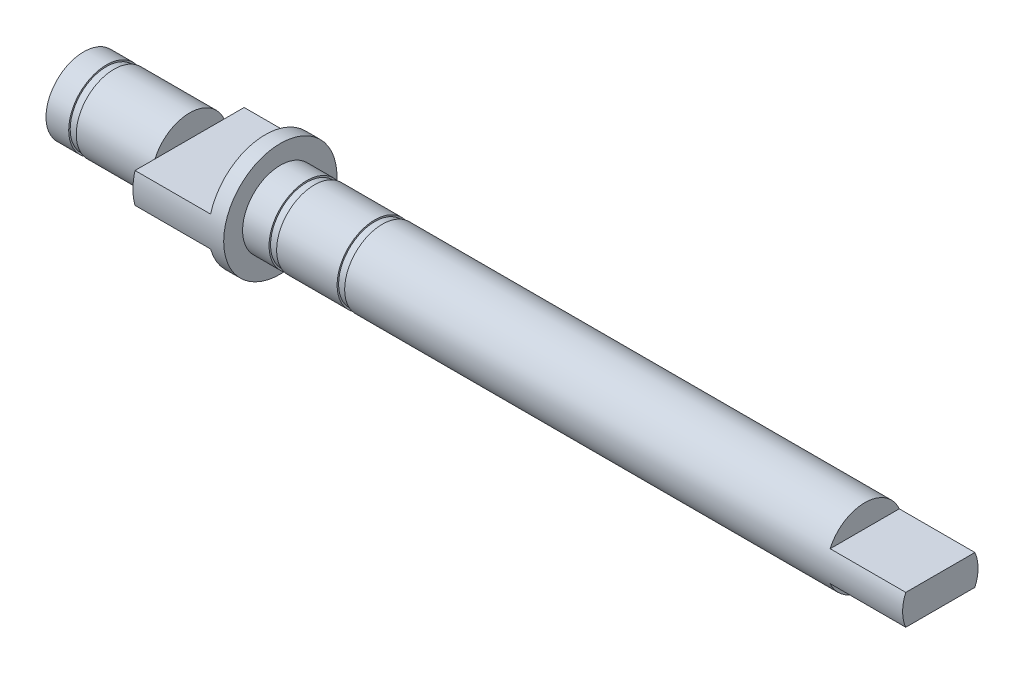
ISO-10303-21;
HEADER;
FILE_DESCRIPTION(('STEP AP214'),'2;1');
FILE_NAME('part.step','',(''),(''),'','','');
FILE_SCHEMA(('AUTOMOTIVE_DESIGN { 1 0 10303 214 1 1 1 1 }'));
ENDSEC;
DATA;
#1=APPLICATION_CONTEXT('core data for automotive mechanical design processes');
#2=APPLICATION_PROTOCOL_DEFINITION('international standard','automotive_design',2000,#1);
#3=PRODUCT_CONTEXT('',#1,'mechanical');
#4=PRODUCT('Part','Part','',(#3));
#5=PRODUCT_RELATED_PRODUCT_CATEGORY('part','',(#4));
#6=PRODUCT_DEFINITION_FORMATION('','',#4);
#7=PRODUCT_DEFINITION_CONTEXT('part definition',#1,'design');
#8=PRODUCT_DEFINITION('design','',#6,#7);
#9=PRODUCT_DEFINITION_SHAPE('','',#8);
#10=(LENGTH_UNIT() NAMED_UNIT(*) SI_UNIT(.MILLI.,.METRE.));
#11=(NAMED_UNIT(*) PLANE_ANGLE_UNIT() SI_UNIT($,.RADIAN.));
#12=(NAMED_UNIT(*) SI_UNIT($,.STERADIAN.) SOLID_ANGLE_UNIT());
#13=UNCERTAINTY_MEASURE_WITH_UNIT(LENGTH_MEASURE(1.E-05),#10,'distance_accuracy_value','');
#14=(GEOMETRIC_REPRESENTATION_CONTEXT(3) GLOBAL_UNCERTAINTY_ASSIGNED_CONTEXT((#13)) GLOBAL_UNIT_ASSIGNED_CONTEXT((#10,
#11,#12)) REPRESENTATION_CONTEXT('',''));
#15=CARTESIAN_POINT('',(0.,0.,0.));
#16=DIRECTION('',(0.,0.,1.));
#17=DIRECTION('',(1.,0.,0.));
#18=AXIS2_PLACEMENT_3D('',#15,#16,#17);
#19=CARTESIAN_POINT('',(14.,0.,-7.49));
#20=DIRECTION('',(1.,0.,0.));
#21=DIRECTION('',(0.,0.,-1.));
#22=AXIS2_PLACEMENT_3D('',#19,#20,#21);
#23=PLANE('',#22);
#24=CARTESIAN_POINT('',(14.,0.,0.));
#25=DIRECTION('',(-1.,0.,0.));
#26=DIRECTION('',(0.,0.,1.));
#27=AXIS2_PLACEMENT_3D('',#24,#25,#26);
#28=CIRCLE('',#27,7.49);
#29=CARTESIAN_POINT('',(14.,-2.,7.2180399001391));
#30=VERTEX_POINT('',#29);
#31=CARTESIAN_POINT('',(14.,2.,7.2180399001391));
#32=VERTEX_POINT('',#31);
#33=EDGE_CURVE('E236',#30,#32,#28,.T.);
#34=ORIENTED_EDGE('',*,*,#33,.T.);
#35=DIRECTION('',(0.,0.,1.));
#36=VECTOR('',#35,1.);
#37=CARTESIAN_POINT('',(14.,2.,7.22841614740048));
#38=LINE('',#37,#36);
#39=CARTESIAN_POINT('',(14.,2.,4.57166271721788));
#40=VERTEX_POINT('',#39);
#41=EDGE_CURVE('E289',#40,#32,#38,.T.);
#42=ORIENTED_EDGE('',*,*,#41,.F.);
#43=CARTESIAN_POINT('',(14.,0.,0.));
#44=DIRECTION('',(-1.,0.,0.));
#45=DIRECTION('',(0.,0.,1.));
#46=AXIS2_PLACEMENT_3D('',#43,#44,#45);
#47=CIRCLE('',#46,4.99);
#48=CARTESIAN_POINT('',(14.,-2.,4.57166271721789));
#49=VERTEX_POINT('',#48);
#50=EDGE_CURVE('E231',#49,#40,#47,.T.);
#51=ORIENTED_EDGE('',*,*,#50,.F.);
#52=DIRECTION('',(0.,0.,-1.));
#53=VECTOR('',#52,1.);
#54=CARTESIAN_POINT('',(14.,-2.,7.22841614740048));
#55=LINE('',#54,#53);
#56=EDGE_CURVE('E288',#30,#49,#55,.T.);
#57=ORIENTED_EDGE('',*,*,#56,.F.);
#58=EDGE_LOOP('',(#34,#42,#51,#57));
#59=FACE_BOUND('',#58,.T.);
#60=ADVANCED_FACE('F47',(#59),#23,.F.);
#61=CARTESIAN_POINT('',(0.,0.,-4.99));
#62=DIRECTION('',(1.,0.,0.));
#63=DIRECTION('',(0.,0.,-1.));
#64=AXIS2_PLACEMENT_3D('',#61,#62,#63);
#65=PLANE('',#64);
#66=CARTESIAN_POINT('',(0.,0.,0.));
#67=DIRECTION('',(-1.,0.,0.));
#68=DIRECTION('',(0.,0.,1.));
#69=AXIS2_PLACEMENT_3D('',#66,#67,#68);
#70=CIRCLE('',#69,4.99);
#71=CARTESIAN_POINT('',(0.,0.,4.99));
#72=VERTEX_POINT('',#71);
#73=EDGE_CURVE('E261',#72,#72,#70,.T.);
#74=ORIENTED_EDGE('',*,*,#73,.T.);
#75=EDGE_LOOP('',(#74));
#76=FACE_BOUND('',#75,.T.);
#77=ADVANCED_FACE('F49',(#76),#65,.F.);
#78=CARTESIAN_POINT('',(113.3,0.,0.));
#79=DIRECTION('',(-1.,0.,0.));
#80=DIRECTION('',(0.,0.,1.));
#81=AXIS2_PLACEMENT_3D('',#78,#79,#80);
#82=PLANE('',#81);
#83=CARTESIAN_POINT('',(113.3,0.,0.));
#84=DIRECTION('',(-1.,0.,0.));
#85=DIRECTION('',(0.,0.,1.));
#86=AXIS2_PLACEMENT_3D('',#83,#84,#85);
#87=CIRCLE('',#86,4.99000000000001);
#88=CARTESIAN_POINT('',(113.3,2.,-4.57166271721789));
#89=VERTEX_POINT('',#88);
#90=CARTESIAN_POINT('',(113.3,-2.,-4.57166271721789));
#91=VERTEX_POINT('',#90);
#92=EDGE_CURVE('E141',#89,#91,#87,.T.);
#93=ORIENTED_EDGE('',*,*,#92,.F.);
#94=DIRECTION('',(0.,0.,-1.));
#95=VECTOR('',#94,1.);
#96=CARTESIAN_POINT('',(113.3,2.,-4.58257569495584));
#97=LINE('',#96,#95);
#98=CARTESIAN_POINT('',(113.3,2.,4.57166271721789));
#99=VERTEX_POINT('',#98);
#100=EDGE_CURVE('E145',#99,#89,#97,.T.);
#101=ORIENTED_EDGE('',*,*,#100,.F.);
#102=CARTESIAN_POINT('',(113.3,-2.,4.57166271721789));
#103=VERTEX_POINT('',#102);
#104=EDGE_CURVE('E143',#103,#99,#87,.T.);
#105=ORIENTED_EDGE('',*,*,#104,.F.);
#106=DIRECTION('',(0.,0.,1.));
#107=VECTOR('',#106,1.);
#108=CARTESIAN_POINT('',(113.3,-2.,4.58257569495584));
#109=LINE('',#108,#107);
#110=EDGE_CURVE('E127',#91,#103,#109,.T.);
#111=ORIENTED_EDGE('',*,*,#110,.F.);
#112=EDGE_LOOP('',(#93,#101,#105,#111));
#113=FACE_BOUND('',#112,.T.);
#114=ADVANCED_FACE('F139',(#113),#82,.F.);
#115=CARTESIAN_POINT('',(0.,0.,0.));
#116=DIRECTION('',(-1.,0.,0.));
#117=DIRECTION('',(0.,0.,1.));
#118=AXIS2_PLACEMENT_3D('',#115,#116,#117);
#119=CYLINDRICAL_SURFACE('',#118,4.99000000000001);
#120=ORIENTED_EDGE('',*,*,#104,.T.);
#121=DIRECTION('',(-1.,0.,0.));
#122=VECTOR('',#121,1.);
#123=CARTESIAN_POINT('',(0.,2.,4.57166271721789));
#124=LINE('',#123,#122);
#125=CARTESIAN_POINT('',(103.3,2.,4.57166271721789));
#126=VERTEX_POINT('',#125);
#127=EDGE_CURVE('E11',#99,#126,#124,.T.);
#128=ORIENTED_EDGE('',*,*,#127,.T.);
#129=CARTESIAN_POINT('',(103.3,0.,0.));
#130=DIRECTION('',(1.,0.,0.));
#131=DIRECTION('',(0.,0.,-1.));
#132=AXIS2_PLACEMENT_3D('',#129,#130,#131);
#133=CIRCLE('',#132,4.99000000000001);
#134=CARTESIAN_POINT('',(103.3,2.,-4.57166271721789));
#135=VERTEX_POINT('',#134);
#136=EDGE_CURVE('E133',#135,#126,#133,.T.);
#137=ORIENTED_EDGE('',*,*,#136,.F.);
#138=DIRECTION('',(-1.,0.,0.));
#139=VECTOR('',#138,1.);
#140=CARTESIAN_POINT('',(0.,2.,-4.57166271721789));
#141=LINE('',#140,#139);
#142=EDGE_CURVE('E56',#135,#89,#141,.F.);
#143=ORIENTED_EDGE('',*,*,#142,.T.);
#144=ORIENTED_EDGE('',*,*,#92,.T.);
#145=DIRECTION('',(-1.,0.,0.));
#146=VECTOR('',#145,1.);
#147=CARTESIAN_POINT('',(0.,-2.,-4.57166271721789));
#148=LINE('',#147,#146);
#149=CARTESIAN_POINT('',(103.3,-2.,-4.57166271721789));
#150=VERTEX_POINT('',#149);
#151=EDGE_CURVE('E124',#91,#150,#148,.T.);
#152=ORIENTED_EDGE('',*,*,#151,.T.);
#153=CARTESIAN_POINT('',(103.3,0.,0.));
#154=DIRECTION('',(1.,0.,0.));
#155=DIRECTION('',(0.,0.,-1.));
#156=AXIS2_PLACEMENT_3D('',#153,#154,#155);
#157=CIRCLE('',#156,4.99000000000001);
#158=CARTESIAN_POINT('',(103.3,-2.,4.57166271721789));
#159=VERTEX_POINT('',#158);
#160=EDGE_CURVE('E165',#159,#150,#157,.T.);
#161=ORIENTED_EDGE('',*,*,#160,.F.);
#162=DIRECTION('',(-1.,0.,0.));
#163=VECTOR('',#162,1.);
#164=CARTESIAN_POINT('',(0.,-2.,4.57166271721789));
#165=LINE('',#164,#163);
#166=EDGE_CURVE('E134',#159,#103,#165,.F.);
#167=ORIENTED_EDGE('',*,*,#166,.T.);
#168=EDGE_LOOP('',(#120,#128,#137,#143,#144,#152,#161,#167));
#169=FACE_BOUND('',#168,.T.);
#170=CARTESIAN_POINT('',(39.5,0.,0.));
#171=DIRECTION('',(-1.,0.,0.));
#172=DIRECTION('',(0.,0.,1.));
#173=AXIS2_PLACEMENT_3D('',#170,#171,#172);
#174=CIRCLE('',#173,4.99);
#175=CARTESIAN_POINT('',(39.5,0.,4.99));
#176=VERTEX_POINT('',#175);
#177=EDGE_CURVE('E158',#176,#176,#174,.T.);
#178=ORIENTED_EDGE('',*,*,#177,.F.);
#179=EDGE_LOOP('',(#178));
#180=FACE_BOUND('',#179,.T.);
#181=ADVANCED_FACE('F148',(#169,#180),#119,.T.);
#182=CARTESIAN_POINT('',(39.5,0.,-4.99));
#183=DIRECTION('',(1.,0.,0.));
#184=DIRECTION('',(0.,0.,-1.));
#185=AXIS2_PLACEMENT_3D('',#182,#183,#184);
#186=PLANE('',#185);
#187=CARTESIAN_POINT('',(39.5,0.,0.));
#188=DIRECTION('',(-1.,0.,0.));
#189=DIRECTION('',(0.,0.,1.));
#190=AXIS2_PLACEMENT_3D('',#187,#188,#189);
#191=CIRCLE('',#190,4.79000000000001);
#192=CARTESIAN_POINT('',(39.5,0.,4.79000000000001));
#193=VERTEX_POINT('',#192);
#194=EDGE_CURVE('E584',#193,#193,#191,.T.);
#195=ORIENTED_EDGE('',*,*,#194,.F.);
#196=EDGE_LOOP('',(#195));
#197=FACE_BOUND('',#196,.T.);
#198=ORIENTED_EDGE('',*,*,#177,.T.);
#199=EDGE_LOOP('',(#198));
#200=FACE_BOUND('',#199,.T.);
#201=ADVANCED_FACE('F437',(#197,#200),#186,.F.);
#202=CARTESIAN_POINT('',(0.,0.,0.));
#203=DIRECTION('',(-1.,0.,0.));
#204=DIRECTION('',(0.,0.,1.));
#205=AXIS2_PLACEMENT_3D('',#202,#203,#204);
#206=CYLINDRICAL_SURFACE('',#205,4.79000000000001);
#207=CARTESIAN_POINT('',(38.5,0.,0.));
#208=DIRECTION('',(-1.,0.,0.));
#209=DIRECTION('',(0.,0.,1.));
#210=AXIS2_PLACEMENT_3D('',#207,#208,#209);
#211=CIRCLE('',#210,4.79000000000001);
#212=CARTESIAN_POINT('',(38.5,0.,4.79000000000001));
#213=VERTEX_POINT('',#212);
#214=EDGE_CURVE('E581',#213,#213,#211,.T.);
#215=ORIENTED_EDGE('',*,*,#214,.F.);
#216=EDGE_LOOP('',(#215));
#217=FACE_BOUND('',#216,.T.);
#218=ORIENTED_EDGE('',*,*,#194,.T.);
#219=EDGE_LOOP('',(#218));
#220=FACE_BOUND('',#219,.T.);
#221=ADVANCED_FACE('F458',(#217,#220),#206,.T.);
#222=CARTESIAN_POINT('',(38.5,0.,-4.79000000000001));
#223=DIRECTION('',(-1.,0.,0.));
#224=DIRECTION('',(0.,0.,1.));
#225=AXIS2_PLACEMENT_3D('',#222,#223,#224);
#226=PLANE('',#225);
#227=CARTESIAN_POINT('',(38.5,0.,0.));
#228=DIRECTION('',(-1.,0.,0.));
#229=DIRECTION('',(0.,0.,1.));
#230=AXIS2_PLACEMENT_3D('',#227,#228,#229);
#231=CIRCLE('',#230,4.99);
#232=CARTESIAN_POINT('',(38.5,0.,4.99));
#233=VERTEX_POINT('',#232);
#234=EDGE_CURVE('E577',#233,#233,#231,.T.);
#235=ORIENTED_EDGE('',*,*,#234,.F.);
#236=EDGE_LOOP('',(#235));
#237=FACE_BOUND('',#236,.T.);
#238=ORIENTED_EDGE('',*,*,#214,.T.);
#239=EDGE_LOOP('',(#238));
#240=FACE_BOUND('',#239,.T.);
#241=ADVANCED_FACE('F467',(#237,#240),#226,.F.);
#242=CARTESIAN_POINT('',(0.,0.,0.));
#243=DIRECTION('',(-1.,0.,0.));
#244=DIRECTION('',(0.,0.,1.));
#245=AXIS2_PLACEMENT_3D('',#242,#243,#244);
#246=CYLINDRICAL_SURFACE('',#245,4.99);
#247=CARTESIAN_POINT('',(30.5,0.,0.));
#248=DIRECTION('',(-1.,0.,0.));
#249=DIRECTION('',(0.,0.,1.));
#250=AXIS2_PLACEMENT_3D('',#247,#248,#249);
#251=CIRCLE('',#250,4.99);
#252=CARTESIAN_POINT('',(30.5,0.,4.99));
#253=VERTEX_POINT('',#252);
#254=EDGE_CURVE('E573',#253,#253,#251,.T.);
#255=ORIENTED_EDGE('',*,*,#254,.F.);
#256=EDGE_LOOP('',(#255));
#257=FACE_BOUND('',#256,.T.);
#258=ORIENTED_EDGE('',*,*,#234,.T.);
#259=EDGE_LOOP('',(#258));
#260=FACE_BOUND('',#259,.T.);
#261=ADVANCED_FACE('F476',(#257,#260),#246,.T.);
#262=CARTESIAN_POINT('',(30.5,0.,-4.99));
#263=DIRECTION('',(1.,0.,0.));
#264=DIRECTION('',(0.,0.,-1.));
#265=AXIS2_PLACEMENT_3D('',#262,#263,#264);
#266=PLANE('',#265);
#267=CARTESIAN_POINT('',(30.5,0.,0.));
#268=DIRECTION('',(-1.,0.,0.));
#269=DIRECTION('',(0.,0.,1.));
#270=AXIS2_PLACEMENT_3D('',#267,#268,#269);
#271=CIRCLE('',#270,4.79000000000001);
#272=CARTESIAN_POINT('',(30.5,0.,4.79000000000001));
#273=VERTEX_POINT('',#272);
#274=EDGE_CURVE('E569',#273,#273,#271,.T.);
#275=ORIENTED_EDGE('',*,*,#274,.F.);
#276=EDGE_LOOP('',(#275));
#277=FACE_BOUND('',#276,.T.);
#278=ORIENTED_EDGE('',*,*,#254,.T.);
#279=EDGE_LOOP('',(#278));
#280=FACE_BOUND('',#279,.T.);
#281=ADVANCED_FACE('F485',(#277,#280),#266,.F.);
#282=CARTESIAN_POINT('',(0.,0.,0.));
#283=DIRECTION('',(-1.,0.,0.));
#284=DIRECTION('',(0.,0.,1.));
#285=AXIS2_PLACEMENT_3D('',#282,#283,#284);
#286=CYLINDRICAL_SURFACE('',#285,4.79000000000001);
#287=CARTESIAN_POINT('',(29.5,0.,0.));
#288=DIRECTION('',(-1.,0.,0.));
#289=DIRECTION('',(0.,0.,1.));
#290=AXIS2_PLACEMENT_3D('',#287,#288,#289);
#291=CIRCLE('',#290,4.79000000000001);
#292=CARTESIAN_POINT('',(29.5,0.,4.79000000000001));
#293=VERTEX_POINT('',#292);
#294=EDGE_CURVE('E562',#293,#293,#291,.T.);
#295=ORIENTED_EDGE('',*,*,#294,.F.);
#296=EDGE_LOOP('',(#295));
#297=FACE_BOUND('',#296,.T.);
#298=ORIENTED_EDGE('',*,*,#274,.T.);
#299=EDGE_LOOP('',(#298));
#300=FACE_BOUND('',#299,.T.);
#301=ADVANCED_FACE('F494',(#297,#300),#286,.T.);
#302=CARTESIAN_POINT('',(29.5,0.,-4.79000000000001));
#303=DIRECTION('',(-1.,0.,0.));
#304=DIRECTION('',(0.,0.,1.));
#305=AXIS2_PLACEMENT_3D('',#302,#303,#304);
#306=PLANE('',#305);
#307=CARTESIAN_POINT('',(29.5,0.,0.));
#308=DIRECTION('',(-1.,0.,0.));
#309=DIRECTION('',(0.,0.,1.));
#310=AXIS2_PLACEMENT_3D('',#307,#308,#309);
#311=CIRCLE('',#310,4.99);
#312=CARTESIAN_POINT('',(29.5,0.,4.99));
#313=VERTEX_POINT('',#312);
#314=EDGE_CURVE('E557',#313,#313,#311,.T.);
#315=ORIENTED_EDGE('',*,*,#314,.F.);
#316=EDGE_LOOP('',(#315));
#317=FACE_BOUND('',#316,.T.);
#318=ORIENTED_EDGE('',*,*,#294,.T.);
#319=EDGE_LOOP('',(#318));
#320=FACE_BOUND('',#319,.T.);
#321=ADVANCED_FACE('F503',(#317,#320),#306,.F.);
#322=CARTESIAN_POINT('',(0.,0.,0.));
#323=DIRECTION('',(-1.,0.,0.));
#324=DIRECTION('',(0.,0.,1.));
#325=AXIS2_PLACEMENT_3D('',#322,#323,#324);
#326=CYLINDRICAL_SURFACE('',#325,4.99);
#327=CARTESIAN_POINT('',(26.,0.,0.));
#328=DIRECTION('',(-1.,0.,0.));
#329=DIRECTION('',(0.,0.,1.));
#330=AXIS2_PLACEMENT_3D('',#327,#328,#329);
#331=CIRCLE('',#330,4.99);
#332=CARTESIAN_POINT('',(26.,0.,4.99));
#333=VERTEX_POINT('',#332);
#334=EDGE_CURVE('E555',#333,#333,#331,.T.);
#335=ORIENTED_EDGE('',*,*,#334,.F.);
#336=EDGE_LOOP('',(#335));
#337=FACE_BOUND('',#336,.T.);
#338=ORIENTED_EDGE('',*,*,#314,.T.);
#339=EDGE_LOOP('',(#338));
#340=FACE_BOUND('',#339,.T.);
#341=ADVANCED_FACE('F511',(#337,#340),#326,.T.);
#342=CARTESIAN_POINT('',(26.,0.,-4.99));
#343=DIRECTION('',(-1.,0.,0.));
#344=DIRECTION('',(0.,0.,1.));
#345=AXIS2_PLACEMENT_3D('',#342,#343,#344);
#346=PLANE('',#345);
#347=CARTESIAN_POINT('',(26.,0.,0.));
#348=DIRECTION('',(-1.,0.,0.));
#349=DIRECTION('',(0.,0.,1.));
#350=AXIS2_PLACEMENT_3D('',#347,#348,#349);
#351=CIRCLE('',#350,7.49);
#352=CARTESIAN_POINT('',(26.,0.,7.49));
#353=VERTEX_POINT('',#352);
#354=EDGE_CURVE('E552',#353,#353,#351,.T.);
#355=ORIENTED_EDGE('',*,*,#354,.F.);
#356=EDGE_LOOP('',(#355));
#357=FACE_BOUND('',#356,.T.);
#358=ORIENTED_EDGE('',*,*,#334,.T.);
#359=EDGE_LOOP('',(#358));
#360=FACE_BOUND('',#359,.T.);
#361=ADVANCED_FACE('F211',(#357,#360),#346,.F.);
#362=CARTESIAN_POINT('',(0.,0.,0.));
#363=DIRECTION('',(-1.,0.,0.));
#364=DIRECTION('',(0.,0.,1.));
#365=AXIS2_PLACEMENT_3D('',#362,#363,#364);
#366=CYLINDRICAL_SURFACE('',#365,7.49);
#367=CARTESIAN_POINT('',(24.,0.,0.));
#368=DIRECTION('',(1.,0.,0.));
#369=DIRECTION('',(0.,0.,-1.));
#370=AXIS2_PLACEMENT_3D('',#367,#368,#369);
#371=CIRCLE('',#370,7.49);
#372=CARTESIAN_POINT('',(24.,2.,-7.2180399001391));
#373=VERTEX_POINT('',#372);
#374=CARTESIAN_POINT('',(24.,2.,7.2180399001391));
#375=VERTEX_POINT('',#374);
#376=EDGE_CURVE('E156',#373,#375,#371,.T.);
#377=ORIENTED_EDGE('',*,*,#376,.T.);
#378=DIRECTION('',(-1.,0.,0.));
#379=VECTOR('',#378,1.);
#380=CARTESIAN_POINT('',(0.,2.,7.2180399001391));
#381=LINE('',#380,#379);
#382=EDGE_CURVE('E265',#375,#32,#381,.T.);
#383=ORIENTED_EDGE('',*,*,#382,.T.);
#384=ORIENTED_EDGE('',*,*,#33,.F.);
#385=DIRECTION('',(-1.,0.,0.));
#386=VECTOR('',#385,1.);
#387=CARTESIAN_POINT('',(0.,-2.,7.2180399001391));
#388=LINE('',#387,#386);
#389=CARTESIAN_POINT('',(24.,-2.,7.2180399001391));
#390=VERTEX_POINT('',#389);
#391=EDGE_CURVE('E277',#30,#390,#388,.F.);
#392=ORIENTED_EDGE('',*,*,#391,.T.);
#393=CARTESIAN_POINT('',(24.,0.,0.));
#394=DIRECTION('',(-1.,0.,0.));
#395=DIRECTION('',(0.,0.,1.));
#396=AXIS2_PLACEMENT_3D('',#393,#394,#395);
#397=CIRCLE('',#396,7.49);
#398=CARTESIAN_POINT('',(24.,-2.,-7.2180399001391));
#399=VERTEX_POINT('',#398);
#400=EDGE_CURVE('E152',#399,#390,#397,.T.);
#401=ORIENTED_EDGE('',*,*,#400,.F.);
#402=DIRECTION('',(-1.,0.,0.));
#403=VECTOR('',#402,1.);
#404=CARTESIAN_POINT('',(0.,-2.,-7.2180399001391));
#405=LINE('',#404,#403);
#406=CARTESIAN_POINT('',(14.,-2.,-7.2180399001391));
#407=VERTEX_POINT('',#406);
#408=EDGE_CURVE('E273',#399,#407,#405,.T.);
#409=ORIENTED_EDGE('',*,*,#408,.T.);
#410=CARTESIAN_POINT('',(14.,2.,-7.2180399001391));
#411=VERTEX_POINT('',#410);
#412=EDGE_CURVE('E238',#411,#407,#28,.T.);
#413=ORIENTED_EDGE('',*,*,#412,.F.);
#414=DIRECTION('',(-1.,0.,0.));
#415=VECTOR('',#414,1.);
#416=CARTESIAN_POINT('',(0.,2.,-7.2180399001391));
#417=LINE('',#416,#415);
#418=EDGE_CURVE('E269',#411,#373,#417,.F.);
#419=ORIENTED_EDGE('',*,*,#418,.T.);
#420=EDGE_LOOP('',(#377,#383,#384,#392,#401,#409,#413,#419));
#421=FACE_BOUND('',#420,.T.);
#422=ORIENTED_EDGE('',*,*,#354,.T.);
#423=EDGE_LOOP('',(#422));
#424=FACE_BOUND('',#423,.T.);
#425=ADVANCED_FACE('F204',(#421,#424),#366,.T.);
#426=CARTESIAN_POINT('',(14.,2.,-4.57166271721788));
#427=VERTEX_POINT('',#426);
#428=CARTESIAN_POINT('',(14.,-2.,-4.57166271721789));
#429=VERTEX_POINT('',#428);
#430=EDGE_CURVE('E217',#427,#429,#47,.T.);
#431=ORIENTED_EDGE('',*,*,#430,.F.);
#432=EDGE_CURVE('E220',#411,#427,#38,.T.);
#433=ORIENTED_EDGE('',*,*,#432,.F.);
#434=ORIENTED_EDGE('',*,*,#412,.T.);
#435=EDGE_CURVE('E222',#429,#407,#55,.T.);
#436=ORIENTED_EDGE('',*,*,#435,.F.);
#437=EDGE_LOOP('',(#431,#433,#434,#436));
#438=FACE_BOUND('',#437,.T.);
#439=ADVANCED_FACE('F192',(#438),#23,.F.);
#440=CARTESIAN_POINT('',(0.,0.,0.));
#441=DIRECTION('',(-1.,0.,0.));
#442=DIRECTION('',(0.,0.,1.));
#443=AXIS2_PLACEMENT_3D('',#440,#441,#442);
#444=CYLINDRICAL_SURFACE('',#443,4.99);
#445=CARTESIAN_POINT('',(4.,0.,0.));
#446=DIRECTION('',(-1.,0.,0.));
#447=DIRECTION('',(0.,0.,1.));
#448=AXIS2_PLACEMENT_3D('',#445,#446,#447);
#449=CIRCLE('',#448,4.99);
#450=CARTESIAN_POINT('',(4.,0.,4.99));
#451=VERTEX_POINT('',#450);
#452=EDGE_CURVE('E242',#451,#451,#449,.T.);
#453=ORIENTED_EDGE('',*,*,#452,.F.);
#454=EDGE_LOOP('',(#453));
#455=FACE_BOUND('',#454,.T.);
#456=EDGE_CURVE('E226',#40,#427,#47,.T.);
#457=ORIENTED_EDGE('',*,*,#456,.T.);
#458=ORIENTED_EDGE('',*,*,#430,.T.);
#459=EDGE_CURVE('E227',#429,#49,#47,.T.);
#460=ORIENTED_EDGE('',*,*,#459,.T.);
#461=ORIENTED_EDGE('',*,*,#50,.T.);
#462=EDGE_LOOP('',(#457,#458,#460,#461));
#463=FACE_BOUND('',#462,.T.);
#464=ADVANCED_FACE('F203',(#455,#463),#444,.T.);
#465=CARTESIAN_POINT('',(4.,0.,-4.99));
#466=DIRECTION('',(1.,0.,0.));
#467=DIRECTION('',(0.,0.,-1.));
#468=AXIS2_PLACEMENT_3D('',#465,#466,#467);
#469=PLANE('',#468);
#470=CARTESIAN_POINT('',(4.,0.,0.));
#471=DIRECTION('',(-1.,0.,0.));
#472=DIRECTION('',(0.,0.,1.));
#473=AXIS2_PLACEMENT_3D('',#470,#471,#472);
#474=CIRCLE('',#473,4.79);
#475=CARTESIAN_POINT('',(4.,0.,4.79));
#476=VERTEX_POINT('',#475);
#477=EDGE_CURVE('E246',#476,#476,#474,.T.);
#478=ORIENTED_EDGE('',*,*,#477,.F.);
#479=EDGE_LOOP('',(#478));
#480=FACE_BOUND('',#479,.T.);
#481=ORIENTED_EDGE('',*,*,#452,.T.);
#482=EDGE_LOOP('',(#481));
#483=FACE_BOUND('',#482,.T.);
#484=ADVANCED_FACE('F209',(#480,#483),#469,.F.);
#485=CARTESIAN_POINT('',(0.,0.,0.));
#486=DIRECTION('',(-1.,0.,0.));
#487=DIRECTION('',(0.,0.,1.));
#488=AXIS2_PLACEMENT_3D('',#485,#486,#487);
#489=CYLINDRICAL_SURFACE('',#488,4.79);
#490=CARTESIAN_POINT('',(3.,0.,0.));
#491=DIRECTION('',(-1.,0.,0.));
#492=DIRECTION('',(0.,0.,1.));
#493=AXIS2_PLACEMENT_3D('',#490,#491,#492);
#494=CIRCLE('',#493,4.79);
#495=CARTESIAN_POINT('',(3.,0.,4.79));
#496=VERTEX_POINT('',#495);
#497=EDGE_CURVE('E251',#496,#496,#494,.T.);
#498=ORIENTED_EDGE('',*,*,#497,.F.);
#499=EDGE_LOOP('',(#498));
#500=FACE_BOUND('',#499,.T.);
#501=ORIENTED_EDGE('',*,*,#477,.T.);
#502=EDGE_LOOP('',(#501));
#503=FACE_BOUND('',#502,.T.);
#504=ADVANCED_FACE('F335',(#500,#503),#489,.T.);
#505=CARTESIAN_POINT('',(3.,0.,-4.79));
#506=DIRECTION('',(-1.,0.,0.));
#507=DIRECTION('',(0.,0.,1.));
#508=AXIS2_PLACEMENT_3D('',#505,#506,#507);
#509=PLANE('',#508);
#510=CARTESIAN_POINT('',(3.,0.,0.));
#511=DIRECTION('',(-1.,0.,0.));
#512=DIRECTION('',(0.,0.,1.));
#513=AXIS2_PLACEMENT_3D('',#510,#511,#512);
#514=CIRCLE('',#513,4.99);
#515=CARTESIAN_POINT('',(3.,0.,4.99));
#516=VERTEX_POINT('',#515);
#517=EDGE_CURVE('E257',#516,#516,#514,.T.);
#518=ORIENTED_EDGE('',*,*,#517,.F.);
#519=EDGE_LOOP('',(#518));
#520=FACE_BOUND('',#519,.T.);
#521=ORIENTED_EDGE('',*,*,#497,.T.);
#522=EDGE_LOOP('',(#521));
#523=FACE_BOUND('',#522,.T.);
#524=ADVANCED_FACE('F331',(#520,#523),#509,.F.);
#525=CARTESIAN_POINT('',(0.,0.,0.));
#526=DIRECTION('',(-1.,0.,0.));
#527=DIRECTION('',(0.,0.,1.));
#528=AXIS2_PLACEMENT_3D('',#525,#526,#527);
#529=CYLINDRICAL_SURFACE('',#528,4.99);
#530=ORIENTED_EDGE('',*,*,#73,.F.);
#531=EDGE_LOOP('',(#530));
#532=FACE_BOUND('',#531,.T.);
#533=ORIENTED_EDGE('',*,*,#517,.T.);
#534=EDGE_LOOP('',(#533));
#535=FACE_BOUND('',#534,.T.);
#536=ADVANCED_FACE('F328',(#532,#535),#529,.T.);
#537=CARTESIAN_POINT('',(24.,0.,0.));
#538=DIRECTION('',(-1.,0.,0.));
#539=DIRECTION('',(0.,0.,1.));
#540=AXIS2_PLACEMENT_3D('',#537,#538,#539);
#541=PLANE('',#540);
#542=ORIENTED_EDGE('',*,*,#400,.T.);
#543=DIRECTION('',(0.,0.,-1.));
#544=VECTOR('',#543,1.);
#545=CARTESIAN_POINT('',(24.,-2.,7.22841614740048));
#546=LINE('',#545,#544);
#547=EDGE_CURVE('E176',#390,#399,#546,.T.);
#548=ORIENTED_EDGE('',*,*,#547,.T.);
#549=EDGE_LOOP('',(#542,#548));
#550=FACE_BOUND('',#549,.T.);
#551=ADVANCED_FACE('F321',(#550),#541,.T.);
#552=CARTESIAN_POINT('',(24.,-2.,7.22841614740048));
#553=DIRECTION('',(0.,1.,0.));
#554=DIRECTION('',(0.,0.,1.));
#555=AXIS2_PLACEMENT_3D('',#552,#553,#554);
#556=PLANE('',#555);
#557=ORIENTED_EDGE('',*,*,#547,.F.);
#558=ORIENTED_EDGE('',*,*,#391,.F.);
#559=ORIENTED_EDGE('',*,*,#56,.T.);
#560=EDGE_CURVE('E287',#49,#429,#55,.T.);
#561=ORIENTED_EDGE('',*,*,#560,.T.);
#562=ORIENTED_EDGE('',*,*,#435,.T.);
#563=ORIENTED_EDGE('',*,*,#408,.F.);
#564=EDGE_LOOP('',(#557,#558,#559,#561,#562,#563));
#565=FACE_BOUND('',#564,.T.);
#566=ADVANCED_FACE('F317',(#565),#556,.F.);
#567=CARTESIAN_POINT('',(14.,0.,0.));
#568=DIRECTION('',(-1.,0.,0.));
#569=DIRECTION('',(0.,0.,1.));
#570=AXIS2_PLACEMENT_3D('',#567,#568,#569);
#571=PLANE('',#570);
#572=ORIENTED_EDGE('',*,*,#560,.F.);
#573=ORIENTED_EDGE('',*,*,#459,.F.);
#574=EDGE_LOOP('',(#572,#573));
#575=FACE_BOUND('',#574,.T.);
#576=ADVANCED_FACE('F320',(#575),#571,.F.);
#577=CARTESIAN_POINT('',(24.,0.,0.));
#578=DIRECTION('',(1.,0.,0.));
#579=DIRECTION('',(0.,0.,-1.));
#580=AXIS2_PLACEMENT_3D('',#577,#578,#579);
#581=PLANE('',#580);
#582=DIRECTION('',(0.,0.,1.));
#583=VECTOR('',#582,1.);
#584=CARTESIAN_POINT('',(24.,2.,7.22841614740048));
#585=LINE('',#584,#583);
#586=EDGE_CURVE('E281',#373,#375,#585,.T.);
#587=ORIENTED_EDGE('',*,*,#586,.T.);
#588=ORIENTED_EDGE('',*,*,#376,.F.);
#589=EDGE_LOOP('',(#587,#588));
#590=FACE_BOUND('',#589,.T.);
#591=ADVANCED_FACE('F314',(#590),#581,.F.);
#592=CARTESIAN_POINT('',(24.,2.,7.22841614740048));
#593=DIRECTION('',(0.,-1.,0.));
#594=DIRECTION('',(0.,0.,-1.));
#595=AXIS2_PLACEMENT_3D('',#592,#593,#594);
#596=PLANE('',#595);
#597=ORIENTED_EDGE('',*,*,#586,.F.);
#598=ORIENTED_EDGE('',*,*,#418,.F.);
#599=ORIENTED_EDGE('',*,*,#432,.T.);
#600=EDGE_CURVE('E292',#427,#40,#38,.T.);
#601=ORIENTED_EDGE('',*,*,#600,.T.);
#602=ORIENTED_EDGE('',*,*,#41,.T.);
#603=ORIENTED_EDGE('',*,*,#382,.F.);
#604=EDGE_LOOP('',(#597,#598,#599,#601,#602,#603));
#605=FACE_BOUND('',#604,.T.);
#606=ADVANCED_FACE('F306',(#605),#596,.F.);
#607=CARTESIAN_POINT('',(14.,0.,0.));
#608=DIRECTION('',(1.,0.,0.));
#609=DIRECTION('',(0.,0.,-1.));
#610=AXIS2_PLACEMENT_3D('',#607,#608,#609);
#611=PLANE('',#610);
#612=ORIENTED_EDGE('',*,*,#456,.F.);
#613=ORIENTED_EDGE('',*,*,#600,.F.);
#614=EDGE_LOOP('',(#612,#613));
#615=FACE_BOUND('',#614,.T.);
#616=ADVANCED_FACE('F186',(#615),#611,.T.);
#617=CARTESIAN_POINT('',(103.3,-2.,4.58257569495584));
#618=DIRECTION('',(0.,1.,0.));
#619=DIRECTION('',(0.,0.,1.));
#620=AXIS2_PLACEMENT_3D('',#617,#618,#619);
#621=PLANE('',#620);
#622=ORIENTED_EDGE('',*,*,#110,.T.);
#623=ORIENTED_EDGE('',*,*,#166,.F.);
#624=DIRECTION('',(0.,0.,1.));
#625=VECTOR('',#624,1.);
#626=CARTESIAN_POINT('',(103.3,-2.,4.58257569495584));
#627=LINE('',#626,#625);
#628=EDGE_CURVE('E69',#150,#159,#627,.T.);
#629=ORIENTED_EDGE('',*,*,#628,.F.);
#630=ORIENTED_EDGE('',*,*,#151,.F.);
#631=EDGE_LOOP('',(#622,#623,#629,#630));
#632=FACE_BOUND('',#631,.T.);
#633=ADVANCED_FACE('F126',(#632),#621,.F.);
#634=CARTESIAN_POINT('',(103.3,0.,0.));
#635=DIRECTION('',(1.,0.,0.));
#636=DIRECTION('',(0.,0.,-1.));
#637=AXIS2_PLACEMENT_3D('',#634,#635,#636);
#638=PLANE('',#637);
#639=ORIENTED_EDGE('',*,*,#160,.T.);
#640=ORIENTED_EDGE('',*,*,#628,.T.);
#641=EDGE_LOOP('',(#639,#640));
#642=FACE_BOUND('',#641,.T.);
#643=ADVANCED_FACE('F178',(#642),#638,.T.);
#644=CARTESIAN_POINT('',(103.3,2.,-4.58257569495584));
#645=DIRECTION('',(0.,-1.,0.));
#646=DIRECTION('',(0.,0.,-1.));
#647=AXIS2_PLACEMENT_3D('',#644,#645,#646);
#648=PLANE('',#647);
#649=ORIENTED_EDGE('',*,*,#100,.T.);
#650=ORIENTED_EDGE('',*,*,#142,.F.);
#651=DIRECTION('',(0.,0.,-1.));
#652=VECTOR('',#651,1.);
#653=CARTESIAN_POINT('',(103.3,2.,-4.58257569495584));
#654=LINE('',#653,#652);
#655=EDGE_CURVE('E62',#126,#135,#654,.T.);
#656=ORIENTED_EDGE('',*,*,#655,.F.);
#657=ORIENTED_EDGE('',*,*,#127,.F.);
#658=EDGE_LOOP('',(#649,#650,#656,#657));
#659=FACE_BOUND('',#658,.T.);
#660=ADVANCED_FACE('F174',(#659),#648,.F.);
#661=CARTESIAN_POINT('',(103.3,0.,0.));
#662=DIRECTION('',(1.,0.,0.));
#663=DIRECTION('',(0.,0.,-1.));
#664=AXIS2_PLACEMENT_3D('',#661,#662,#663);
#665=PLANE('',#664);
#666=ORIENTED_EDGE('',*,*,#136,.T.);
#667=ORIENTED_EDGE('',*,*,#655,.T.);
#668=EDGE_LOOP('',(#666,#667));
#669=FACE_BOUND('',#668,.T.);
#670=ADVANCED_FACE('F172',(#669),#665,.T.);
#671=CLOSED_SHELL('',(#60,#77,#114,#181,#201,#221,#241,#261,#281,#301,#321,#341,#361,#425,#439,
#464,#484,#504,#524,#536,#551,#566,#576,#591,#606,#616,#633,#643,#660,#670));
#672=MANIFOLD_SOLID_BREP('B2',#671);
#673=ADVANCED_BREP_SHAPE_REPRESENTATION('',(#18,#672),#14);
#674=SHAPE_DEFINITION_REPRESENTATION(#9,#673);
ENDSEC;
END-ISO-10303-21;
